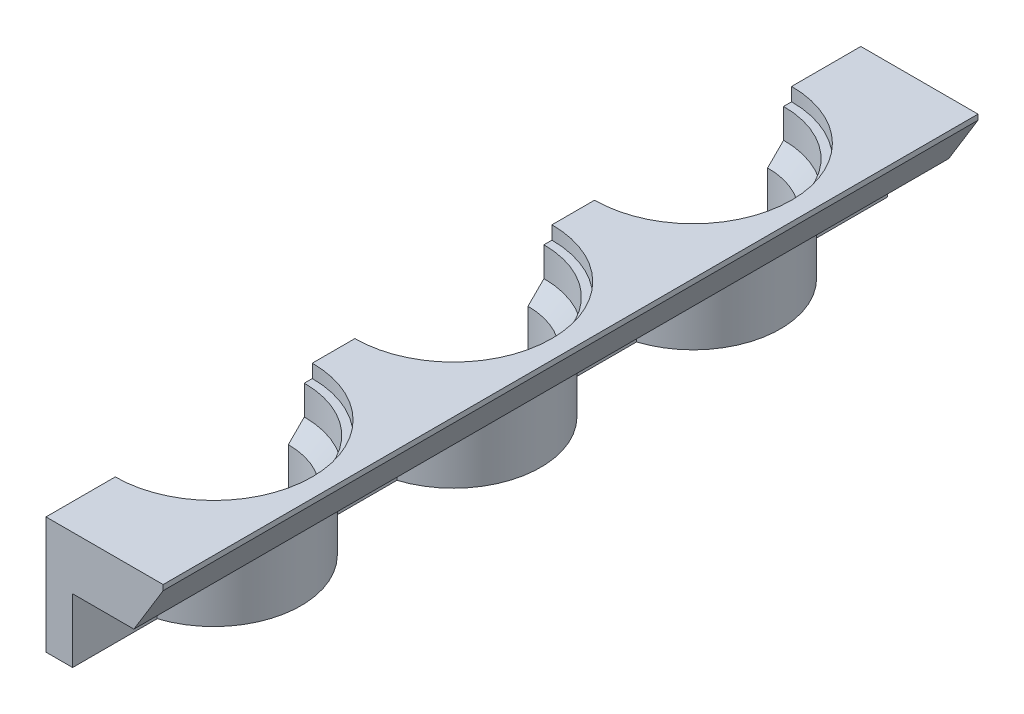
ISO-10303-21;
HEADER;
FILE_DESCRIPTION(('STEP AP214'),'2;1');
FILE_NAME('part.step','',(''),(''),'','','');
FILE_SCHEMA(('AUTOMOTIVE_DESIGN { 1 0 10303 214 1 1 1 1 }'));
ENDSEC;
DATA;
#1=APPLICATION_CONTEXT('core data for automotive mechanical design processes');
#2=APPLICATION_PROTOCOL_DEFINITION('international standard','automotive_design',2000,#1);
#3=PRODUCT_CONTEXT('',#1,'mechanical');
#4=PRODUCT('Part','Part','',(#3));
#5=PRODUCT_RELATED_PRODUCT_CATEGORY('part','',(#4));
#6=PRODUCT_DEFINITION_FORMATION('','',#4);
#7=PRODUCT_DEFINITION_CONTEXT('part definition',#1,'design');
#8=PRODUCT_DEFINITION('design','',#6,#7);
#9=PRODUCT_DEFINITION_SHAPE('','',#8);
#10=(LENGTH_UNIT() NAMED_UNIT(*) SI_UNIT(.MILLI.,.METRE.));
#11=(NAMED_UNIT(*) PLANE_ANGLE_UNIT() SI_UNIT($,.RADIAN.));
#12=(NAMED_UNIT(*) SI_UNIT($,.STERADIAN.) SOLID_ANGLE_UNIT());
#13=UNCERTAINTY_MEASURE_WITH_UNIT(LENGTH_MEASURE(1.E-05),#10,'distance_accuracy_value','');
#14=(GEOMETRIC_REPRESENTATION_CONTEXT(3) GLOBAL_UNCERTAINTY_ASSIGNED_CONTEXT((#13)) GLOBAL_UNIT_ASSIGNED_CONTEXT((#10,
#11,#12)) REPRESENTATION_CONTEXT('',''));
#15=CARTESIAN_POINT('',(0.,0.,0.));
#16=DIRECTION('',(0.,0.,1.));
#17=DIRECTION('',(1.,0.,0.));
#18=AXIS2_PLACEMENT_3D('',#15,#16,#17);
#19=CARTESIAN_POINT('',(0.,-10.,0.));
#20=DIRECTION('',(0.,1.,0.));
#21=DIRECTION('',(0.,0.,1.));
#22=AXIS2_PLACEMENT_3D('',#19,#20,#21);
#23=PLANE('',#22);
#24=DIRECTION('',(-1.,0.,0.));
#25=VECTOR('',#24,1.);
#26=CARTESIAN_POINT('',(0.,-10.,-121.5));
#27=LINE('',#26,#25);
#28=CARTESIAN_POINT('',(16.5,-10.,-121.5));
#29=VERTEX_POINT('',#28);
#30=CARTESIAN_POINT('',(5.00000000000001,-10.,-121.5));
#31=VERTEX_POINT('',#30);
#32=EDGE_CURVE('E312',#29,#31,#27,.T.);
#33=ORIENTED_EDGE('',*,*,#32,.F.);
#34=DIRECTION('',(0.,0.,1.));
#35=VECTOR('',#34,1.);
#36=CARTESIAN_POINT('',(16.5,-10.,31.5));
#37=LINE('',#36,#35);
#38=CARTESIAN_POINT('',(16.5,-10.,31.5));
#39=VERTEX_POINT('',#38);
#40=EDGE_CURVE('E300',#29,#39,#37,.T.);
#41=ORIENTED_EDGE('',*,*,#40,.T.);
#42=DIRECTION('',(1.,0.,0.));
#43=VECTOR('',#42,1.);
#44=CARTESIAN_POINT('',(0.,-10.,31.5));
#45=LINE('',#44,#43);
#46=CARTESIAN_POINT('',(5.00000000000001,-10.,31.5));
#47=VERTEX_POINT('',#46);
#48=EDGE_CURVE('E320',#47,#39,#45,.T.);
#49=ORIENTED_EDGE('',*,*,#48,.F.);
#50=DIRECTION('',(0.,0.,1.));
#51=VECTOR('',#50,1.);
#52=CARTESIAN_POINT('',(5.,-10.,15.6192189305355));
#53=LINE('',#52,#51);
#54=CARTESIAN_POINT('',(5.,-10.,15.6192189305355));
#55=VERTEX_POINT('',#54);
#56=EDGE_CURVE('E366',#55,#47,#53,.T.);
#57=ORIENTED_EDGE('',*,*,#56,.F.);
#58=CARTESIAN_POINT('',(0.,-10.,0.));
#59=DIRECTION('',(0.,-1.,0.));
#60=DIRECTION('',(0.,0.,-1.));
#61=AXIS2_PLACEMENT_3D('',#58,#59,#60);
#62=CIRCLE('',#61,16.4);
#63=CARTESIAN_POINT('',(5.,-10.,-15.6192189305355));
#64=VERTEX_POINT('',#63);
#65=EDGE_CURVE('E370',#64,#55,#62,.T.);
#66=ORIENTED_EDGE('',*,*,#65,.F.);
#67=DIRECTION('',(0.,0.,1.));
#68=VECTOR('',#67,1.);
#69=CARTESIAN_POINT('',(5.,-10.,-29.3807810694645));
#70=LINE('',#69,#68);
#71=CARTESIAN_POINT('',(5.,-10.,-29.3807810694645));
#72=VERTEX_POINT('',#71);
#73=EDGE_CURVE('E373',#72,#64,#70,.T.);
#74=ORIENTED_EDGE('',*,*,#73,.F.);
#75=CARTESIAN_POINT('',(0.,-10.,-45.));
#76=DIRECTION('',(0.,-1.,0.));
#77=DIRECTION('',(0.,0.,-1.));
#78=AXIS2_PLACEMENT_3D('',#75,#76,#77);
#79=CIRCLE('',#78,16.4);
#80=CARTESIAN_POINT('',(5.,-10.,-60.6192189305355));
#81=VERTEX_POINT('',#80);
#82=EDGE_CURVE('E376',#81,#72,#79,.T.);
#83=ORIENTED_EDGE('',*,*,#82,.F.);
#84=DIRECTION('',(0.,0.,1.));
#85=VECTOR('',#84,1.);
#86=CARTESIAN_POINT('',(5.,-10.,-74.3807810694645));
#87=LINE('',#86,#85);
#88=CARTESIAN_POINT('',(5.,-10.,-74.3807810694645));
#89=VERTEX_POINT('',#88);
#90=EDGE_CURVE('E379',#89,#81,#87,.T.);
#91=ORIENTED_EDGE('',*,*,#90,.F.);
#92=CARTESIAN_POINT('',(0.,-10.,-90.));
#93=DIRECTION('',(0.,-1.,0.));
#94=DIRECTION('',(0.,0.,-1.));
#95=AXIS2_PLACEMENT_3D('',#92,#93,#94);
#96=CIRCLE('',#95,16.4);
#97=CARTESIAN_POINT('',(5.,-10.,-105.619218930536));
#98=VERTEX_POINT('',#97);
#99=EDGE_CURVE('E382',#98,#89,#96,.T.);
#100=ORIENTED_EDGE('',*,*,#99,.F.);
#101=DIRECTION('',(0.,0.,1.));
#102=VECTOR('',#101,1.);
#103=CARTESIAN_POINT('',(5.00000000000001,-10.,-121.5));
#104=LINE('',#103,#102);
#105=EDGE_CURVE('E385',#31,#98,#104,.T.);
#106=ORIENTED_EDGE('',*,*,#105,.F.);
#107=EDGE_LOOP('',(#33,#41,#49,#57,#66,#74,#83,#91,#100,#106));
#108=FACE_BOUND('',#107,.T.);
#109=ADVANCED_FACE('F44',(#108),#23,.F.);
#110=CARTESIAN_POINT('',(0.,-10.,-11.4));
#111=DIRECTION('',(-1.,0.,0.));
#112=DIRECTION('',(0.,0.,1.));
#113=AXIS2_PLACEMENT_3D('',#110,#111,#112);
#114=PLANE('',#113);
#115=CARTESIAN_POINT('',(0.,-13.,-22.5));
#116=DIRECTION('',(-1.,0.,0.));
#117=DIRECTION('',(0.,0.,1.));
#118=AXIS2_PLACEMENT_3D('',#115,#116,#117);
#119=CIRCLE('',#118,1.5);
#120=CARTESIAN_POINT('',(0.,-13.,-21.));
#121=VERTEX_POINT('',#120);
#122=EDGE_CURVE('E493',#121,#121,#119,.T.);
#123=ORIENTED_EDGE('',*,*,#122,.F.);
#124=EDGE_LOOP('',(#123));
#125=FACE_BOUND('',#124,.T.);
#126=DIRECTION('',(0.,1.,0.));
#127=VECTOR('',#126,1.);
#128=CARTESIAN_POINT('',(0.,0.,-14.));
#129=LINE('',#128,#127);
#130=CARTESIAN_POINT('',(0.,-11.,-14.));
#131=VERTEX_POINT('',#130);
#132=CARTESIAN_POINT('',(0.,-22.,-14.));
#133=VERTEX_POINT('',#132);
#134=EDGE_CURVE('E60',#131,#133,#129,.F.);
#135=ORIENTED_EDGE('',*,*,#134,.F.);
#136=DIRECTION('',(0.,-0.707106781186549,0.707106781186546));
#137=VECTOR('',#136,1.);
#138=CARTESIAN_POINT('',(0.,-25.,0.));
#139=LINE('',#138,#137);
#140=CARTESIAN_POINT('',(0.,-8.,-17.));
#141=VERTEX_POINT('',#140);
#142=EDGE_CURVE('E264',#141,#131,#139,.T.);
#143=ORIENTED_EDGE('',*,*,#142,.F.);
#144=DIRECTION('',(0.,1.,0.));
#145=VECTOR('',#144,1.);
#146=CARTESIAN_POINT('',(0.,0.,-17.));
#147=LINE('',#146,#145);
#148=CARTESIAN_POINT('',(0.,-2.5,-17.));
#149=VERTEX_POINT('',#148);
#150=EDGE_CURVE('E464',#149,#141,#147,.F.);
#151=ORIENTED_EDGE('',*,*,#150,.F.);
#152=DIRECTION('',(0.,0.,-1.));
#153=VECTOR('',#152,1.);
#154=CARTESIAN_POINT('',(0.,-2.5,-11.4));
#155=LINE('',#154,#153);
#156=CARTESIAN_POINT('',(0.,-2.5,-18.5));
#157=VERTEX_POINT('',#156);
#158=EDGE_CURVE('E473',#149,#157,#155,.T.);
#159=ORIENTED_EDGE('',*,*,#158,.T.);
#160=DIRECTION('',(0.,1.,0.));
#161=VECTOR('',#160,1.);
#162=CARTESIAN_POINT('',(0.,0.,-18.5));
#163=LINE('',#162,#161);
#164=CARTESIAN_POINT('',(0.,0.,-18.5));
#165=VERTEX_POINT('',#164);
#166=EDGE_CURVE('E476',#165,#157,#163,.F.);
#167=ORIENTED_EDGE('',*,*,#166,.F.);
#168=DIRECTION('',(0.,0.,1.));
#169=VECTOR('',#168,1.);
#170=CARTESIAN_POINT('',(0.,0.,-11.4));
#171=LINE('',#170,#169);
#172=CARTESIAN_POINT('',(0.,0.,-26.5));
#173=VERTEX_POINT('',#172);
#174=EDGE_CURVE('E317',#173,#165,#171,.T.);
#175=ORIENTED_EDGE('',*,*,#174,.F.);
#176=DIRECTION('',(0.,1.,0.));
#177=VECTOR('',#176,1.);
#178=CARTESIAN_POINT('',(0.,0.,-26.5));
#179=LINE('',#178,#177);
#180=CARTESIAN_POINT('',(0.,-2.5,-26.5));
#181=VERTEX_POINT('',#180);
#182=EDGE_CURVE('E450',#181,#173,#179,.T.);
#183=ORIENTED_EDGE('',*,*,#182,.F.);
#184=DIRECTION('',(0.,0.,-1.));
#185=VECTOR('',#184,1.);
#186=CARTESIAN_POINT('',(0.,-2.5,-11.4));
#187=LINE('',#186,#185);
#188=CARTESIAN_POINT('',(0.,-2.5,-28.));
#189=VERTEX_POINT('',#188);
#190=EDGE_CURVE('E447',#181,#189,#187,.T.);
#191=ORIENTED_EDGE('',*,*,#190,.T.);
#192=DIRECTION('',(0.,1.,0.));
#193=VECTOR('',#192,1.);
#194=CARTESIAN_POINT('',(0.,0.,-28.));
#195=LINE('',#194,#193);
#196=CARTESIAN_POINT('',(0.,-8.,-28.));
#197=VERTEX_POINT('',#196);
#198=EDGE_CURVE('E436',#197,#189,#195,.T.);
#199=ORIENTED_EDGE('',*,*,#198,.F.);
#200=DIRECTION('',(0.,0.707106781186549,0.707106781186546));
#201=VECTOR('',#200,1.);
#202=CARTESIAN_POINT('',(0.,-25.,-45.));
#203=LINE('',#202,#201);
#204=CARTESIAN_POINT('',(0.,-11.,-31.));
#205=VERTEX_POINT('',#204);
#206=EDGE_CURVE('E445',#205,#197,#203,.T.);
#207=ORIENTED_EDGE('',*,*,#206,.F.);
#208=DIRECTION('',(0.,1.,0.));
#209=VECTOR('',#208,1.);
#210=CARTESIAN_POINT('',(0.,0.,-31.));
#211=LINE('',#210,#209);
#212=CARTESIAN_POINT('',(0.,-22.,-31.));
#213=VERTEX_POINT('',#212);
#214=EDGE_CURVE('E454',#213,#205,#211,.T.);
#215=ORIENTED_EDGE('',*,*,#214,.F.);
#216=DIRECTION('',(0.,0.,-1.));
#217=VECTOR('',#216,1.);
#218=CARTESIAN_POINT('',(0.,-22.,-33.6));
#219=LINE('',#218,#217);
#220=EDGE_CURVE('E392',#133,#213,#219,.T.);
#221=ORIENTED_EDGE('',*,*,#220,.F.);
#222=EDGE_LOOP('',(#135,#143,#151,#159,#167,#175,#183,#191,#199,#207,#215,#221));
#223=FACE_BOUND('',#222,.T.);
#224=ADVANCED_FACE('F584',(#125,#223),#114,.T.);
#225=CARTESIAN_POINT('',(0.,-10.,-56.4));
#226=DIRECTION('',(-1.,0.,0.));
#227=DIRECTION('',(0.,0.,1.));
#228=AXIS2_PLACEMENT_3D('',#225,#226,#227);
#229=PLANE('',#228);
#230=CARTESIAN_POINT('',(0.,-13.,-67.5));
#231=DIRECTION('',(-1.,0.,0.));
#232=DIRECTION('',(0.,0.,1.));
#233=AXIS2_PLACEMENT_3D('',#230,#231,#232);
#234=CIRCLE('',#233,1.5);
#235=CARTESIAN_POINT('',(0.,-13.,-66.));
#236=VERTEX_POINT('',#235);
#237=EDGE_CURVE('E485',#236,#236,#234,.T.);
#238=ORIENTED_EDGE('',*,*,#237,.F.);
#239=EDGE_LOOP('',(#238));
#240=FACE_BOUND('',#239,.T.);
#241=DIRECTION('',(0.,1.,0.));
#242=VECTOR('',#241,1.);
#243=CARTESIAN_POINT('',(0.,0.,-59.));
#244=LINE('',#243,#242);
#245=CARTESIAN_POINT('',(0.,-11.,-59.));
#246=VERTEX_POINT('',#245);
#247=CARTESIAN_POINT('',(0.,-22.,-59.));
#248=VERTEX_POINT('',#247);
#249=EDGE_CURVE('E68',#246,#248,#244,.F.);
#250=ORIENTED_EDGE('',*,*,#249,.F.);
#251=DIRECTION('',(0.,-0.707106781186549,0.707106781186546));
#252=VECTOR('',#251,1.);
#253=CARTESIAN_POINT('',(0.,-25.,-45.));
#254=LINE('',#253,#252);
#255=CARTESIAN_POINT('',(0.,-8.,-62.));
#256=VERTEX_POINT('',#255);
#257=EDGE_CURVE('E279',#256,#246,#254,.T.);
#258=ORIENTED_EDGE('',*,*,#257,.F.);
#259=DIRECTION('',(0.,1.,0.));
#260=VECTOR('',#259,1.);
#261=CARTESIAN_POINT('',(0.,0.,-62.));
#262=LINE('',#261,#260);
#263=CARTESIAN_POINT('',(0.,-2.5,-62.));
#264=VERTEX_POINT('',#263);
#265=EDGE_CURVE('E281',#264,#256,#262,.F.);
#266=ORIENTED_EDGE('',*,*,#265,.F.);
#267=DIRECTION('',(0.,0.,-1.));
#268=VECTOR('',#267,1.);
#269=CARTESIAN_POINT('',(0.,-2.5,-56.4));
#270=LINE('',#269,#268);
#271=CARTESIAN_POINT('',(0.,-2.5,-63.5));
#272=VERTEX_POINT('',#271);
#273=EDGE_CURVE('E283',#264,#272,#270,.T.);
#274=ORIENTED_EDGE('',*,*,#273,.T.);
#275=DIRECTION('',(0.,1.,0.));
#276=VECTOR('',#275,1.);
#277=CARTESIAN_POINT('',(0.,0.,-63.5));
#278=LINE('',#277,#276);
#279=CARTESIAN_POINT('',(0.,0.,-63.5));
#280=VERTEX_POINT('',#279);
#281=EDGE_CURVE('E452',#280,#272,#278,.F.);
#282=ORIENTED_EDGE('',*,*,#281,.F.);
#283=DIRECTION('',(0.,0.,1.));
#284=VECTOR('',#283,1.);
#285=CARTESIAN_POINT('',(0.,0.,-56.4));
#286=LINE('',#285,#284);
#287=CARTESIAN_POINT('',(0.,0.,-71.5));
#288=VERTEX_POINT('',#287);
#289=EDGE_CURVE('E321',#288,#280,#286,.T.);
#290=ORIENTED_EDGE('',*,*,#289,.F.);
#291=DIRECTION('',(0.,1.,0.));
#292=VECTOR('',#291,1.);
#293=CARTESIAN_POINT('',(0.,0.,-71.5));
#294=LINE('',#293,#292);
#295=CARTESIAN_POINT('',(0.,-2.5,-71.5));
#296=VERTEX_POINT('',#295);
#297=EDGE_CURVE('E421',#296,#288,#294,.T.);
#298=ORIENTED_EDGE('',*,*,#297,.F.);
#299=DIRECTION('',(0.,0.,-1.));
#300=VECTOR('',#299,1.);
#301=CARTESIAN_POINT('',(0.,-2.5,-56.4));
#302=LINE('',#301,#300);
#303=CARTESIAN_POINT('',(0.,-2.5,-73.));
#304=VERTEX_POINT('',#303);
#305=EDGE_CURVE('E418',#296,#304,#302,.T.);
#306=ORIENTED_EDGE('',*,*,#305,.T.);
#307=DIRECTION('',(0.,1.,0.));
#308=VECTOR('',#307,1.);
#309=CARTESIAN_POINT('',(0.,0.,-73.));
#310=LINE('',#309,#308);
#311=CARTESIAN_POINT('',(0.,-8.,-73.));
#312=VERTEX_POINT('',#311);
#313=EDGE_CURVE('E388',#312,#304,#310,.T.);
#314=ORIENTED_EDGE('',*,*,#313,.F.);
#315=DIRECTION('',(0.,0.707106781186549,0.707106781186546));
#316=VECTOR('',#315,1.);
#317=CARTESIAN_POINT('',(0.,-25.,-90.));
#318=LINE('',#317,#316);
#319=CARTESIAN_POINT('',(0.,-11.,-76.));
#320=VERTEX_POINT('',#319);
#321=EDGE_CURVE('E416',#320,#312,#318,.T.);
#322=ORIENTED_EDGE('',*,*,#321,.F.);
#323=DIRECTION('',(0.,1.,0.));
#324=VECTOR('',#323,1.);
#325=CARTESIAN_POINT('',(0.,0.,-76.));
#326=LINE('',#325,#324);
#327=CARTESIAN_POINT('',(0.,-22.,-76.));
#328=VERTEX_POINT('',#327);
#329=EDGE_CURVE('E425',#328,#320,#326,.T.);
#330=ORIENTED_EDGE('',*,*,#329,.F.);
#331=DIRECTION('',(0.,0.,-1.));
#332=VECTOR('',#331,1.);
#333=CARTESIAN_POINT('',(0.,-22.,-78.6));
#334=LINE('',#333,#332);
#335=EDGE_CURVE('E390',#248,#328,#334,.T.);
#336=ORIENTED_EDGE('',*,*,#335,.F.);
#337=EDGE_LOOP('',(#250,#258,#266,#274,#282,#290,#298,#306,#314,#322,#330,#336));
#338=FACE_BOUND('',#337,.T.);
#339=ADVANCED_FACE('F589',(#240,#338),#229,.T.);
#340=CARTESIAN_POINT('',(0.,-10.,-101.4));
#341=DIRECTION('',(-1.,0.,0.));
#342=DIRECTION('',(0.,0.,1.));
#343=AXIS2_PLACEMENT_3D('',#340,#341,#342);
#344=PLANE('',#343);
#345=CARTESIAN_POINT('',(0.,-13.,-112.5));
#346=DIRECTION('',(-1.,0.,0.));
#347=DIRECTION('',(0.,0.,1.));
#348=AXIS2_PLACEMENT_3D('',#345,#346,#347);
#349=CIRCLE('',#348,1.5);
#350=CARTESIAN_POINT('',(0.,-13.,-111.));
#351=VERTEX_POINT('',#350);
#352=EDGE_CURVE('E503',#351,#351,#349,.T.);
#353=ORIENTED_EDGE('',*,*,#352,.F.);
#354=EDGE_LOOP('',(#353));
#355=FACE_BOUND('',#354,.T.);
#356=DIRECTION('',(0.,1.,0.));
#357=VECTOR('',#356,1.);
#358=CARTESIAN_POINT('',(0.,0.,-104.));
#359=LINE('',#358,#357);
#360=CARTESIAN_POINT('',(0.,-11.,-104.));
#361=VERTEX_POINT('',#360);
#362=CARTESIAN_POINT('',(0.,-22.,-104.));
#363=VERTEX_POINT('',#362);
#364=EDGE_CURVE('E427',#361,#363,#359,.F.);
#365=ORIENTED_EDGE('',*,*,#364,.F.);
#366=DIRECTION('',(0.,-0.707106781186549,0.707106781186546));
#367=VECTOR('',#366,1.);
#368=CARTESIAN_POINT('',(0.,-25.,-90.));
#369=LINE('',#368,#367);
#370=CARTESIAN_POINT('',(0.,-8.,-107.));
#371=VERTEX_POINT('',#370);
#372=EDGE_CURVE('E288',#371,#361,#369,.T.);
#373=ORIENTED_EDGE('',*,*,#372,.F.);
#374=DIRECTION('',(0.,1.,0.));
#375=VECTOR('',#374,1.);
#376=CARTESIAN_POINT('',(0.,0.,-107.));
#377=LINE('',#376,#375);
#378=CARTESIAN_POINT('',(0.,-2.5,-107.));
#379=VERTEX_POINT('',#378);
#380=EDGE_CURVE('E290',#379,#371,#377,.F.);
#381=ORIENTED_EDGE('',*,*,#380,.F.);
#382=DIRECTION('',(0.,0.,-1.));
#383=VECTOR('',#382,1.);
#384=CARTESIAN_POINT('',(0.,-2.5,-101.4));
#385=LINE('',#384,#383);
#386=CARTESIAN_POINT('',(0.,-2.5,-108.5));
#387=VERTEX_POINT('',#386);
#388=EDGE_CURVE('E292',#379,#387,#385,.T.);
#389=ORIENTED_EDGE('',*,*,#388,.T.);
#390=DIRECTION('',(0.,1.,0.));
#391=VECTOR('',#390,1.);
#392=CARTESIAN_POINT('',(0.,0.,-108.5));
#393=LINE('',#392,#391);
#394=CARTESIAN_POINT('',(0.,0.,-108.5));
#395=VERTEX_POINT('',#394);
#396=EDGE_CURVE('E423',#395,#387,#393,.F.);
#397=ORIENTED_EDGE('',*,*,#396,.F.);
#398=DIRECTION('',(0.,0.,1.));
#399=VECTOR('',#398,1.);
#400=CARTESIAN_POINT('',(0.,0.,-101.4));
#401=LINE('',#400,#399);
#402=CARTESIAN_POINT('',(0.,0.,-121.5));
#403=VERTEX_POINT('',#402);
#404=EDGE_CURVE('E324',#403,#395,#401,.T.);
#405=ORIENTED_EDGE('',*,*,#404,.F.);
#406=DIRECTION('',(0.,1.,0.));
#407=VECTOR('',#406,1.);
#408=CARTESIAN_POINT('',(0.,-10.,-121.5));
#409=LINE('',#408,#407);
#410=CARTESIAN_POINT('',(0.,-22.,-121.5));
#411=VERTEX_POINT('',#410);
#412=EDGE_CURVE('E307',#411,#403,#409,.T.);
#413=ORIENTED_EDGE('',*,*,#412,.F.);
#414=DIRECTION('',(0.,0.,-1.));
#415=VECTOR('',#414,1.);
#416=CARTESIAN_POINT('',(0.,-22.,-121.5));
#417=LINE('',#416,#415);
#418=EDGE_CURVE('E365',#363,#411,#417,.T.);
#419=ORIENTED_EDGE('',*,*,#418,.F.);
#420=EDGE_LOOP('',(#365,#373,#381,#389,#397,#405,#413,#419));
#421=FACE_BOUND('',#420,.T.);
#422=ADVANCED_FACE('F597',(#355,#421),#344,.T.);
#423=CARTESIAN_POINT('',(0.,-10.,-121.5));
#424=DIRECTION('',(0.,0.,-1.));
#425=DIRECTION('',(-1.,0.,0.));
#426=AXIS2_PLACEMENT_3D('',#423,#424,#425);
#427=PLANE('',#426);
#428=DIRECTION('',(0.,1.,0.));
#429=VECTOR('',#428,1.);
#430=CARTESIAN_POINT('',(22.,-10.,-121.5));
#431=LINE('',#430,#429);
#432=CARTESIAN_POINT('',(22.,-0.999999999999937,-121.5));
#433=VERTEX_POINT('',#432);
#434=CARTESIAN_POINT('',(22.,0.,-121.5));
#435=VERTEX_POINT('',#434);
#436=EDGE_CURVE('E314',#433,#435,#431,.T.);
#437=ORIENTED_EDGE('',*,*,#436,.F.);
#438=DIRECTION('',(-0.521450009453974,-0.85328183365196,0.));
#439=VECTOR('',#438,1.);
#440=CARTESIAN_POINT('',(12.0134831460674,-17.3415730337078,-121.5));
#441=LINE('',#440,#439);
#442=EDGE_CURVE('E302',#433,#29,#441,.T.);
#443=ORIENTED_EDGE('',*,*,#442,.T.);
#444=ORIENTED_EDGE('',*,*,#32,.T.);
#445=DIRECTION('',(0.,1.,0.));
#446=VECTOR('',#445,1.);
#447=CARTESIAN_POINT('',(5.00000000000001,-22.,-121.5));
#448=LINE('',#447,#446);
#449=CARTESIAN_POINT('',(5.00000000000001,-22.,-121.5));
#450=VERTEX_POINT('',#449);
#451=EDGE_CURVE('E338',#450,#31,#448,.T.);
#452=ORIENTED_EDGE('',*,*,#451,.F.);
#453=DIRECTION('',(1.,0.,0.));
#454=VECTOR('',#453,1.);
#455=CARTESIAN_POINT('',(0.,-22.,-121.5));
#456=LINE('',#455,#454);
#457=EDGE_CURVE('E369',#411,#450,#456,.T.);
#458=ORIENTED_EDGE('',*,*,#457,.F.);
#459=ORIENTED_EDGE('',*,*,#412,.T.);
#460=DIRECTION('',(-1.,0.,0.));
#461=VECTOR('',#460,1.);
#462=CARTESIAN_POINT('',(0.,0.,-121.5));
#463=LINE('',#462,#461);
#464=EDGE_CURVE('E327',#435,#403,#463,.T.);
#465=ORIENTED_EDGE('',*,*,#464,.F.);
#466=EDGE_LOOP('',(#437,#443,#444,#452,#458,#459,#465));
#467=FACE_BOUND('',#466,.T.);
#468=ADVANCED_FACE('F538',(#467),#427,.T.);
#469=CARTESIAN_POINT('',(22.,-10.,31.5));
#470=DIRECTION('',(1.,0.,0.));
#471=DIRECTION('',(0.,0.,-1.));
#472=AXIS2_PLACEMENT_3D('',#469,#470,#471);
#473=PLANE('',#472);
#474=DIRECTION('',(0.,1.,0.));
#475=VECTOR('',#474,1.);
#476=CARTESIAN_POINT('',(22.,-10.,31.5));
#477=LINE('',#476,#475);
#478=CARTESIAN_POINT('',(22.,-0.999999999999937,31.5));
#479=VERTEX_POINT('',#478);
#480=CARTESIAN_POINT('',(22.,0.,31.5));
#481=VERTEX_POINT('',#480);
#482=EDGE_CURVE('E311',#479,#481,#477,.T.);
#483=ORIENTED_EDGE('',*,*,#482,.F.);
#484=DIRECTION('',(0.,0.,-1.));
#485=VECTOR('',#484,1.);
#486=CARTESIAN_POINT('',(22.,-0.999999999999937,-121.5));
#487=LINE('',#486,#485);
#488=EDGE_CURVE('E304',#479,#433,#487,.T.);
#489=ORIENTED_EDGE('',*,*,#488,.T.);
#490=ORIENTED_EDGE('',*,*,#436,.T.);
#491=DIRECTION('',(0.,0.,-1.));
#492=VECTOR('',#491,1.);
#493=CARTESIAN_POINT('',(22.,0.,31.5));
#494=LINE('',#493,#492);
#495=EDGE_CURVE('E330',#481,#435,#494,.T.);
#496=ORIENTED_EDGE('',*,*,#495,.F.);
#497=EDGE_LOOP('',(#483,#489,#490,#496));
#498=FACE_BOUND('',#497,.T.);
#499=ADVANCED_FACE('F549',(#498),#473,.T.);
#500=CARTESIAN_POINT('',(0.,-10.,31.5));
#501=DIRECTION('',(0.,0.,1.));
#502=DIRECTION('',(1.,0.,0.));
#503=AXIS2_PLACEMENT_3D('',#500,#501,#502);
#504=PLANE('',#503);
#505=ORIENTED_EDGE('',*,*,#48,.T.);
#506=DIRECTION('',(0.521450009453974,0.85328183365196,0.));
#507=VECTOR('',#506,1.);
#508=CARTESIAN_POINT('',(12.0134831460674,-17.3415730337078,31.5));
#509=LINE('',#508,#507);
#510=EDGE_CURVE('E298',#39,#479,#509,.T.);
#511=ORIENTED_EDGE('',*,*,#510,.T.);
#512=ORIENTED_EDGE('',*,*,#482,.T.);
#513=DIRECTION('',(1.,0.,0.));
#514=VECTOR('',#513,1.);
#515=CARTESIAN_POINT('',(0.,0.,31.5));
#516=LINE('',#515,#514);
#517=CARTESIAN_POINT('',(0.,0.,31.5));
#518=VERTEX_POINT('',#517);
#519=EDGE_CURVE('E333',#518,#481,#516,.T.);
#520=ORIENTED_EDGE('',*,*,#519,.F.);
#521=DIRECTION('',(0.,1.,0.));
#522=VECTOR('',#521,1.);
#523=CARTESIAN_POINT('',(0.,-10.,31.5));
#524=LINE('',#523,#522);
#525=CARTESIAN_POINT('',(0.,-22.,31.5));
#526=VERTEX_POINT('',#525);
#527=EDGE_CURVE('E308',#526,#518,#524,.T.);
#528=ORIENTED_EDGE('',*,*,#527,.F.);
#529=DIRECTION('',(-1.,0.,0.));
#530=VECTOR('',#529,1.);
#531=CARTESIAN_POINT('',(0.,-22.,31.5));
#532=LINE('',#531,#530);
#533=CARTESIAN_POINT('',(5.00000000000001,-22.,31.5));
#534=VERTEX_POINT('',#533);
#535=EDGE_CURVE('E396',#534,#526,#532,.T.);
#536=ORIENTED_EDGE('',*,*,#535,.F.);
#537=DIRECTION('',(0.,1.,0.));
#538=VECTOR('',#537,1.);
#539=CARTESIAN_POINT('',(5.00000000000001,-22.,31.5));
#540=LINE('',#539,#538);
#541=EDGE_CURVE('E362',#534,#47,#540,.T.);
#542=ORIENTED_EDGE('',*,*,#541,.T.);
#543=EDGE_LOOP('',(#505,#511,#512,#520,#528,#536,#542));
#544=FACE_BOUND('',#543,.T.);
#545=ADVANCED_FACE('F545',(#544),#504,.T.);
#546=CARTESIAN_POINT('',(0.,-10.,11.4));
#547=DIRECTION('',(-1.,0.,0.));
#548=DIRECTION('',(0.,0.,1.));
#549=AXIS2_PLACEMENT_3D('',#546,#547,#548);
#550=PLANE('',#549);
#551=CARTESIAN_POINT('',(0.,-13.,22.5));
#552=DIRECTION('',(-1.,0.,0.));
#553=DIRECTION('',(0.,0.,1.));
#554=AXIS2_PLACEMENT_3D('',#551,#552,#553);
#555=CIRCLE('',#554,1.5);
#556=CARTESIAN_POINT('',(0.,-13.,24.));
#557=VERTEX_POINT('',#556);
#558=EDGE_CURVE('E496',#557,#557,#555,.T.);
#559=ORIENTED_EDGE('',*,*,#558,.F.);
#560=EDGE_LOOP('',(#559));
#561=FACE_BOUND('',#560,.T.);
#562=DIRECTION('',(0.,1.,0.));
#563=VECTOR('',#562,1.);
#564=CARTESIAN_POINT('',(0.,0.,14.));
#565=LINE('',#564,#563);
#566=CARTESIAN_POINT('',(0.,-22.,14.));
#567=VERTEX_POINT('',#566);
#568=CARTESIAN_POINT('',(0.,-11.,14.));
#569=VERTEX_POINT('',#568);
#570=EDGE_CURVE('E248',#567,#569,#565,.T.);
#571=ORIENTED_EDGE('',*,*,#570,.F.);
#572=DIRECTION('',(0.,0.,-1.));
#573=VECTOR('',#572,1.);
#574=CARTESIAN_POINT('',(0.,-22.,11.4));
#575=LINE('',#574,#573);
#576=EDGE_CURVE('E394',#526,#567,#575,.T.);
#577=ORIENTED_EDGE('',*,*,#576,.F.);
#578=ORIENTED_EDGE('',*,*,#527,.T.);
#579=DIRECTION('',(0.,0.,1.));
#580=VECTOR('',#579,1.);
#581=CARTESIAN_POINT('',(0.,0.,11.4));
#582=LINE('',#581,#580);
#583=CARTESIAN_POINT('',(0.,0.,18.5));
#584=VERTEX_POINT('',#583);
#585=EDGE_CURVE('E336',#584,#518,#582,.T.);
#586=ORIENTED_EDGE('',*,*,#585,.F.);
#587=DIRECTION('',(0.,1.,0.));
#588=VECTOR('',#587,1.);
#589=CARTESIAN_POINT('',(0.,0.,18.5));
#590=LINE('',#589,#588);
#591=CARTESIAN_POINT('',(0.,-2.5,18.5));
#592=VERTEX_POINT('',#591);
#593=EDGE_CURVE('E478',#592,#584,#590,.T.);
#594=ORIENTED_EDGE('',*,*,#593,.F.);
#595=DIRECTION('',(0.,0.,-1.));
#596=VECTOR('',#595,1.);
#597=CARTESIAN_POINT('',(0.,-2.5,11.4));
#598=LINE('',#597,#596);
#599=CARTESIAN_POINT('',(0.,-2.5,17.));
#600=VERTEX_POINT('',#599);
#601=EDGE_CURVE('E272',#592,#600,#598,.T.);
#602=ORIENTED_EDGE('',*,*,#601,.T.);
#603=DIRECTION('',(0.,1.,0.));
#604=VECTOR('',#603,1.);
#605=CARTESIAN_POINT('',(0.,0.,17.));
#606=LINE('',#605,#604);
#607=CARTESIAN_POINT('',(0.,-8.,17.));
#608=VERTEX_POINT('',#607);
#609=EDGE_CURVE('E53',#608,#600,#606,.T.);
#610=ORIENTED_EDGE('',*,*,#609,.F.);
#611=DIRECTION('',(0.,0.707106781186549,0.707106781186546));
#612=VECTOR('',#611,1.);
#613=CARTESIAN_POINT('',(0.,-25.,0.));
#614=LINE('',#613,#612);
#615=EDGE_CURVE('E11',#569,#608,#614,.T.);
#616=ORIENTED_EDGE('',*,*,#615,.F.);
#617=EDGE_LOOP('',(#571,#577,#578,#586,#594,#602,#610,#616));
#618=FACE_BOUND('',#617,.T.);
#619=ADVANCED_FACE('F269',(#561,#618),#550,.T.);
#620=CARTESIAN_POINT('',(0.,0.,0.));
#621=DIRECTION('',(0.,1.,0.));
#622=DIRECTION('',(0.,0.,1.));
#623=AXIS2_PLACEMENT_3D('',#620,#621,#622);
#624=PLANE('',#623);
#625=CARTESIAN_POINT('',(0.,0.,0.));
#626=DIRECTION('',(0.,1.,0.));
#627=DIRECTION('',(0.,0.,1.));
#628=AXIS2_PLACEMENT_3D('',#625,#626,#627);
#629=CIRCLE('',#628,18.5);
#630=EDGE_CURVE('E266',#584,#165,#629,.T.);
#631=ORIENTED_EDGE('',*,*,#630,.F.);
#632=ORIENTED_EDGE('',*,*,#585,.T.);
#633=ORIENTED_EDGE('',*,*,#519,.T.);
#634=ORIENTED_EDGE('',*,*,#495,.T.);
#635=ORIENTED_EDGE('',*,*,#464,.T.);
#636=ORIENTED_EDGE('',*,*,#404,.T.);
#637=CARTESIAN_POINT('',(0.,0.,-90.));
#638=DIRECTION('',(0.,1.,0.));
#639=DIRECTION('',(0.,0.,1.));
#640=AXIS2_PLACEMENT_3D('',#637,#638,#639);
#641=CIRCLE('',#640,18.5);
#642=EDGE_CURVE('E430',#288,#395,#641,.T.);
#643=ORIENTED_EDGE('',*,*,#642,.F.);
#644=ORIENTED_EDGE('',*,*,#289,.T.);
#645=CARTESIAN_POINT('',(0.,0.,-45.));
#646=DIRECTION('',(0.,1.,0.));
#647=DIRECTION('',(0.,0.,1.));
#648=AXIS2_PLACEMENT_3D('',#645,#646,#647);
#649=CIRCLE('',#648,18.5);
#650=EDGE_CURVE('E458',#173,#280,#649,.T.);
#651=ORIENTED_EDGE('',*,*,#650,.F.);
#652=ORIENTED_EDGE('',*,*,#174,.T.);
#653=EDGE_LOOP('',(#631,#632,#633,#634,#635,#636,#643,#644,#651,#652));
#654=FACE_BOUND('',#653,.T.);
#655=ADVANCED_FACE('F518',(#654),#624,.T.);
#656=CARTESIAN_POINT('',(5.00000000000001,-22.,-121.5));
#657=DIRECTION('',(-1.,0.,0.));
#658=DIRECTION('',(0.,0.,1.));
#659=AXIS2_PLACEMENT_3D('',#656,#657,#658);
#660=PLANE('',#659);
#661=CARTESIAN_POINT('',(5.,-13.,-112.5));
#662=DIRECTION('',(1.,0.,0.));
#663=DIRECTION('',(0.,0.,-1.));
#664=AXIS2_PLACEMENT_3D('',#661,#662,#663);
#665=CIRCLE('',#664,1.5);
#666=CARTESIAN_POINT('',(5.,-13.,-114.));
#667=VERTEX_POINT('',#666);
#668=EDGE_CURVE('E508',#667,#667,#665,.T.);
#669=ORIENTED_EDGE('',*,*,#668,.F.);
#670=EDGE_LOOP('',(#669));
#671=FACE_BOUND('',#670,.T.);
#672=ORIENTED_EDGE('',*,*,#105,.T.);
#673=DIRECTION('',(0.,1.,0.));
#674=VECTOR('',#673,1.);
#675=CARTESIAN_POINT('',(5.,-22.,-105.619218930536));
#676=LINE('',#675,#674);
#677=CARTESIAN_POINT('',(5.,-22.,-105.619218930536));
#678=VERTEX_POINT('',#677);
#679=EDGE_CURVE('E344',#678,#98,#676,.T.);
#680=ORIENTED_EDGE('',*,*,#679,.F.);
#681=DIRECTION('',(0.,0.,1.));
#682=VECTOR('',#681,1.);
#683=CARTESIAN_POINT('',(5.00000000000001,-22.,-121.5));
#684=LINE('',#683,#682);
#685=EDGE_CURVE('E411',#450,#678,#684,.T.);
#686=ORIENTED_EDGE('',*,*,#685,.F.);
#687=ORIENTED_EDGE('',*,*,#451,.T.);
#688=EDGE_LOOP('',(#672,#680,#686,#687));
#689=FACE_BOUND('',#688,.T.);
#690=ADVANCED_FACE('F514',(#671,#689),#660,.F.);
#691=CARTESIAN_POINT('',(0.,-22.,-90.));
#692=DIRECTION('',(0.,1.,0.));
#693=DIRECTION('',(0.,0.,1.));
#694=AXIS2_PLACEMENT_3D('',#691,#692,#693);
#695=CYLINDRICAL_SURFACE('',#694,16.4);
#696=ORIENTED_EDGE('',*,*,#99,.T.);
#697=DIRECTION('',(0.,1.,0.));
#698=VECTOR('',#697,1.);
#699=CARTESIAN_POINT('',(5.,-22.,-74.3807810694645));
#700=LINE('',#699,#698);
#701=CARTESIAN_POINT('',(5.,-22.,-74.3807810694645));
#702=VERTEX_POINT('',#701);
#703=EDGE_CURVE('E347',#702,#89,#700,.T.);
#704=ORIENTED_EDGE('',*,*,#703,.F.);
#705=CARTESIAN_POINT('',(0.,-22.,-90.));
#706=DIRECTION('',(0.,-1.,0.));
#707=DIRECTION('',(0.,0.,-1.));
#708=AXIS2_PLACEMENT_3D('',#705,#706,#707);
#709=CIRCLE('',#708,16.4);
#710=EDGE_CURVE('E409',#678,#702,#709,.T.);
#711=ORIENTED_EDGE('',*,*,#710,.F.);
#712=ORIENTED_EDGE('',*,*,#679,.T.);
#713=EDGE_LOOP('',(#696,#704,#711,#712));
#714=FACE_BOUND('',#713,.T.);
#715=ADVANCED_FACE('F517',(#714),#695,.T.);
#716=CARTESIAN_POINT('',(5.,-22.,-74.3807810694645));
#717=DIRECTION('',(-1.,0.,0.));
#718=DIRECTION('',(0.,0.,1.));
#719=AXIS2_PLACEMENT_3D('',#716,#717,#718);
#720=PLANE('',#719);
#721=CARTESIAN_POINT('',(5.,-13.,-67.5));
#722=DIRECTION('',(1.,0.,0.));
#723=DIRECTION('',(0.,0.,-1.));
#724=AXIS2_PLACEMENT_3D('',#721,#722,#723);
#725=CIRCLE('',#724,1.5);
#726=CARTESIAN_POINT('',(5.,-13.,-69.));
#727=VERTEX_POINT('',#726);
#728=EDGE_CURVE('E490',#727,#727,#725,.T.);
#729=ORIENTED_EDGE('',*,*,#728,.F.);
#730=EDGE_LOOP('',(#729));
#731=FACE_BOUND('',#730,.T.);
#732=ORIENTED_EDGE('',*,*,#90,.T.);
#733=DIRECTION('',(0.,1.,0.));
#734=VECTOR('',#733,1.);
#735=CARTESIAN_POINT('',(5.,-22.,-60.6192189305355));
#736=LINE('',#735,#734);
#737=CARTESIAN_POINT('',(5.,-22.,-60.6192189305355));
#738=VERTEX_POINT('',#737);
#739=EDGE_CURVE('E350',#738,#81,#736,.T.);
#740=ORIENTED_EDGE('',*,*,#739,.F.);
#741=DIRECTION('',(0.,0.,1.));
#742=VECTOR('',#741,1.);
#743=CARTESIAN_POINT('',(5.,-22.,-74.3807810694645));
#744=LINE('',#743,#742);
#745=EDGE_CURVE('E407',#702,#738,#744,.T.);
#746=ORIENTED_EDGE('',*,*,#745,.F.);
#747=ORIENTED_EDGE('',*,*,#703,.T.);
#748=EDGE_LOOP('',(#732,#740,#746,#747));
#749=FACE_BOUND('',#748,.T.);
#750=ADVANCED_FACE('F572',(#731,#749),#720,.F.);
#751=CARTESIAN_POINT('',(0.,-22.,-45.));
#752=DIRECTION('',(0.,1.,0.));
#753=DIRECTION('',(0.,0.,1.));
#754=AXIS2_PLACEMENT_3D('',#751,#752,#753);
#755=CYLINDRICAL_SURFACE('',#754,16.4);
#756=ORIENTED_EDGE('',*,*,#82,.T.);
#757=DIRECTION('',(0.,1.,0.));
#758=VECTOR('',#757,1.);
#759=CARTESIAN_POINT('',(5.,-22.,-29.3807810694645));
#760=LINE('',#759,#758);
#761=CARTESIAN_POINT('',(5.,-22.,-29.3807810694645));
#762=VERTEX_POINT('',#761);
#763=EDGE_CURVE('E353',#762,#72,#760,.T.);
#764=ORIENTED_EDGE('',*,*,#763,.F.);
#765=CARTESIAN_POINT('',(0.,-22.,-45.));
#766=DIRECTION('',(0.,-1.,0.));
#767=DIRECTION('',(0.,0.,-1.));
#768=AXIS2_PLACEMENT_3D('',#765,#766,#767);
#769=CIRCLE('',#768,16.4);
#770=EDGE_CURVE('E405',#738,#762,#769,.T.);
#771=ORIENTED_EDGE('',*,*,#770,.F.);
#772=ORIENTED_EDGE('',*,*,#739,.T.);
#773=EDGE_LOOP('',(#756,#764,#771,#772));
#774=FACE_BOUND('',#773,.T.);
#775=ADVANCED_FACE('F569',(#774),#755,.T.);
#776=CARTESIAN_POINT('',(5.,-22.,-29.3807810694645));
#777=DIRECTION('',(-1.,0.,0.));
#778=DIRECTION('',(0.,0.,1.));
#779=AXIS2_PLACEMENT_3D('',#776,#777,#778);
#780=PLANE('',#779);
#781=CARTESIAN_POINT('',(5.,-13.,-22.5));
#782=DIRECTION('',(1.,0.,0.));
#783=DIRECTION('',(0.,0.,-1.));
#784=AXIS2_PLACEMENT_3D('',#781,#782,#783);
#785=CIRCLE('',#784,1.5);
#786=CARTESIAN_POINT('',(5.,-13.,-24.));
#787=VERTEX_POINT('',#786);
#788=EDGE_CURVE('E499',#787,#787,#785,.T.);
#789=ORIENTED_EDGE('',*,*,#788,.F.);
#790=EDGE_LOOP('',(#789));
#791=FACE_BOUND('',#790,.T.);
#792=ORIENTED_EDGE('',*,*,#73,.T.);
#793=DIRECTION('',(0.,1.,0.));
#794=VECTOR('',#793,1.);
#795=CARTESIAN_POINT('',(5.,-22.,-15.6192189305355));
#796=LINE('',#795,#794);
#797=CARTESIAN_POINT('',(5.,-22.,-15.6192189305355));
#798=VERTEX_POINT('',#797);
#799=EDGE_CURVE('E356',#798,#64,#796,.T.);
#800=ORIENTED_EDGE('',*,*,#799,.F.);
#801=DIRECTION('',(0.,0.,1.));
#802=VECTOR('',#801,1.);
#803=CARTESIAN_POINT('',(5.,-22.,-29.3807810694645));
#804=LINE('',#803,#802);
#805=EDGE_CURVE('E403',#762,#798,#804,.T.);
#806=ORIENTED_EDGE('',*,*,#805,.F.);
#807=ORIENTED_EDGE('',*,*,#763,.T.);
#808=EDGE_LOOP('',(#792,#800,#806,#807));
#809=FACE_BOUND('',#808,.T.);
#810=ADVANCED_FACE('F566',(#791,#809),#780,.F.);
#811=CARTESIAN_POINT('',(0.,-22.,0.));
#812=DIRECTION('',(0.,1.,0.));
#813=DIRECTION('',(0.,0.,1.));
#814=AXIS2_PLACEMENT_3D('',#811,#812,#813);
#815=CYLINDRICAL_SURFACE('',#814,16.4);
#816=ORIENTED_EDGE('',*,*,#65,.T.);
#817=DIRECTION('',(0.,1.,0.));
#818=VECTOR('',#817,1.);
#819=CARTESIAN_POINT('',(5.,-22.,15.6192189305355));
#820=LINE('',#819,#818);
#821=CARTESIAN_POINT('',(5.,-22.,15.6192189305355));
#822=VERTEX_POINT('',#821);
#823=EDGE_CURVE('E359',#822,#55,#820,.T.);
#824=ORIENTED_EDGE('',*,*,#823,.F.);
#825=CARTESIAN_POINT('',(0.,-22.,0.));
#826=DIRECTION('',(0.,-1.,0.));
#827=DIRECTION('',(0.,0.,-1.));
#828=AXIS2_PLACEMENT_3D('',#825,#826,#827);
#829=CIRCLE('',#828,16.4);
#830=EDGE_CURVE('E401',#798,#822,#829,.T.);
#831=ORIENTED_EDGE('',*,*,#830,.F.);
#832=ORIENTED_EDGE('',*,*,#799,.T.);
#833=EDGE_LOOP('',(#816,#824,#831,#832));
#834=FACE_BOUND('',#833,.T.);
#835=ADVANCED_FACE('F562',(#834),#815,.T.);
#836=CARTESIAN_POINT('',(5.,-22.,15.6192189305355));
#837=DIRECTION('',(-1.,0.,0.));
#838=DIRECTION('',(0.,0.,1.));
#839=AXIS2_PLACEMENT_3D('',#836,#837,#838);
#840=PLANE('',#839);
#841=CARTESIAN_POINT('',(5.,-13.,22.5));
#842=DIRECTION('',(1.,0.,0.));
#843=DIRECTION('',(0.,0.,-1.));
#844=AXIS2_PLACEMENT_3D('',#841,#842,#843);
#845=CIRCLE('',#844,1.5);
#846=CARTESIAN_POINT('',(5.,-13.,21.));
#847=VERTEX_POINT('',#846);
#848=EDGE_CURVE('E500',#847,#847,#845,.T.);
#849=ORIENTED_EDGE('',*,*,#848,.F.);
#850=EDGE_LOOP('',(#849));
#851=FACE_BOUND('',#850,.T.);
#852=ORIENTED_EDGE('',*,*,#56,.T.);
#853=ORIENTED_EDGE('',*,*,#541,.F.);
#854=DIRECTION('',(0.,0.,1.));
#855=VECTOR('',#854,1.);
#856=CARTESIAN_POINT('',(5.,-22.,15.6192189305355));
#857=LINE('',#856,#855);
#858=EDGE_CURVE('E399',#822,#534,#857,.T.);
#859=ORIENTED_EDGE('',*,*,#858,.F.);
#860=ORIENTED_EDGE('',*,*,#823,.T.);
#861=EDGE_LOOP('',(#852,#853,#859,#860));
#862=FACE_BOUND('',#861,.T.);
#863=ADVANCED_FACE('F560',(#851,#862),#840,.F.);
#864=CARTESIAN_POINT('',(0.,-22.,-90.));
#865=DIRECTION('',(0.,-1.,0.));
#866=DIRECTION('',(0.,0.,-1.));
#867=AXIS2_PLACEMENT_3D('',#864,#865,#866);
#868=PLANE('',#867);
#869=CARTESIAN_POINT('',(0.,-22.,0.));
#870=DIRECTION('',(0.,-1.,0.));
#871=DIRECTION('',(0.,0.,-1.));
#872=AXIS2_PLACEMENT_3D('',#869,#870,#871);
#873=CIRCLE('',#872,14.);
#874=EDGE_CURVE('E252',#133,#567,#873,.T.);
#875=ORIENTED_EDGE('',*,*,#874,.F.);
#876=ORIENTED_EDGE('',*,*,#220,.T.);
#877=CARTESIAN_POINT('',(0.,-22.,-45.));
#878=DIRECTION('',(0.,-1.,0.));
#879=DIRECTION('',(0.,0.,-1.));
#880=AXIS2_PLACEMENT_3D('',#877,#878,#879);
#881=CIRCLE('',#880,14.);
#882=EDGE_CURVE('E286',#248,#213,#881,.T.);
#883=ORIENTED_EDGE('',*,*,#882,.F.);
#884=ORIENTED_EDGE('',*,*,#335,.T.);
#885=CARTESIAN_POINT('',(0.,-22.,-90.));
#886=DIRECTION('',(0.,-1.,0.));
#887=DIRECTION('',(0.,0.,-1.));
#888=AXIS2_PLACEMENT_3D('',#885,#886,#887);
#889=CIRCLE('',#888,14.);
#890=EDGE_CURVE('E295',#363,#328,#889,.T.);
#891=ORIENTED_EDGE('',*,*,#890,.F.);
#892=ORIENTED_EDGE('',*,*,#418,.T.);
#893=ORIENTED_EDGE('',*,*,#457,.T.);
#894=ORIENTED_EDGE('',*,*,#685,.T.);
#895=ORIENTED_EDGE('',*,*,#710,.T.);
#896=ORIENTED_EDGE('',*,*,#745,.T.);
#897=ORIENTED_EDGE('',*,*,#770,.T.);
#898=ORIENTED_EDGE('',*,*,#805,.T.);
#899=ORIENTED_EDGE('',*,*,#830,.T.);
#900=ORIENTED_EDGE('',*,*,#858,.T.);
#901=ORIENTED_EDGE('',*,*,#535,.T.);
#902=ORIENTED_EDGE('',*,*,#576,.T.);
#903=EDGE_LOOP('',(#875,#876,#883,#884,#891,#892,#893,#894,#895,#896,#897,#898,#899,#900,#901,#902));
#904=FACE_BOUND('',#903,.T.);
#905=ADVANCED_FACE('F530',(#904),#868,.T.);
#906=CARTESIAN_POINT('',(22.,-0.999999999999937,31.5));
#907=DIRECTION('',(0.85328183365196,-0.521450009453973,0.));
#908=DIRECTION('',(0.,0.,1.));
#909=AXIS2_PLACEMENT_3D('',#906,#907,#908);
#910=PLANE('',#909);
#911=ORIENTED_EDGE('',*,*,#510,.F.);
#912=ORIENTED_EDGE('',*,*,#40,.F.);
#913=ORIENTED_EDGE('',*,*,#442,.F.);
#914=ORIENTED_EDGE('',*,*,#488,.F.);
#915=EDGE_LOOP('',(#911,#912,#913,#914));
#916=FACE_BOUND('',#915,.T.);
#917=ADVANCED_FACE('F47',(#916),#910,.T.);
#918=CARTESIAN_POINT('',(0.,0.,-90.));
#919=DIRECTION('',(0.,1.,0.));
#920=DIRECTION('',(0.,0.,1.));
#921=AXIS2_PLACEMENT_3D('',#918,#919,#920);
#922=CYLINDRICAL_SURFACE('',#921,14.);
#923=ORIENTED_EDGE('',*,*,#329,.T.);
#924=CARTESIAN_POINT('',(0.,-11.,-90.));
#925=DIRECTION('',(0.,1.,0.));
#926=DIRECTION('',(0.,0.,1.));
#927=AXIS2_PLACEMENT_3D('',#924,#925,#926);
#928=CIRCLE('',#927,14.);
#929=EDGE_CURVE('E432',#320,#361,#928,.T.);
#930=ORIENTED_EDGE('',*,*,#929,.T.);
#931=ORIENTED_EDGE('',*,*,#364,.T.);
#932=ORIENTED_EDGE('',*,*,#890,.T.);
#933=EDGE_LOOP('',(#923,#930,#931,#932));
#934=FACE_BOUND('',#933,.T.);
#935=ADVANCED_FACE('F692',(#934),#922,.F.);
#936=CARTESIAN_POINT('',(0.,0.,-90.));
#937=DIRECTION('',(0.,1.,0.));
#938=DIRECTION('',(0.,0.,1.));
#939=AXIS2_PLACEMENT_3D('',#936,#937,#938);
#940=CYLINDRICAL_SURFACE('',#939,17.);
#941=ORIENTED_EDGE('',*,*,#313,.T.);
#942=CARTESIAN_POINT('',(0.,-2.5,-90.));
#943=DIRECTION('',(0.,1.,0.));
#944=DIRECTION('',(0.,0.,1.));
#945=AXIS2_PLACEMENT_3D('',#942,#943,#944);
#946=CIRCLE('',#945,17.);
#947=EDGE_CURVE('E429',#304,#379,#946,.T.);
#948=ORIENTED_EDGE('',*,*,#947,.T.);
#949=ORIENTED_EDGE('',*,*,#380,.T.);
#950=CARTESIAN_POINT('',(0.,-8.,-90.));
#951=DIRECTION('',(0.,1.,0.));
#952=DIRECTION('',(0.,0.,1.));
#953=AXIS2_PLACEMENT_3D('',#950,#951,#952);
#954=CIRCLE('',#953,17.);
#955=EDGE_CURVE('E439',#312,#371,#954,.T.);
#956=ORIENTED_EDGE('',*,*,#955,.F.);
#957=EDGE_LOOP('',(#941,#948,#949,#956));
#958=FACE_BOUND('',#957,.T.);
#959=ADVANCED_FACE('F688',(#958),#940,.F.);
#960=CARTESIAN_POINT('',(0.,-8.,-90.));
#961=DIRECTION('',(0.,1.,0.));
#962=DIRECTION('',(0.,0.,1.));
#963=AXIS2_PLACEMENT_3D('',#960,#961,#962);
#964=CONICAL_SURFACE('',#963,17.,0.785398163397447);
#965=ORIENTED_EDGE('',*,*,#321,.T.);
#966=ORIENTED_EDGE('',*,*,#955,.T.);
#967=ORIENTED_EDGE('',*,*,#372,.T.);
#968=ORIENTED_EDGE('',*,*,#929,.F.);
#969=EDGE_LOOP('',(#965,#966,#967,#968));
#970=FACE_BOUND('',#969,.T.);
#971=ADVANCED_FACE('F684',(#970),#964,.F.);
#972=CARTESIAN_POINT('',(0.,0.,-90.));
#973=DIRECTION('',(0.,1.,0.));
#974=DIRECTION('',(0.,0.,1.));
#975=AXIS2_PLACEMENT_3D('',#972,#973,#974);
#976=CYLINDRICAL_SURFACE('',#975,18.5);
#977=ORIENTED_EDGE('',*,*,#297,.T.);
#978=ORIENTED_EDGE('',*,*,#642,.T.);
#979=ORIENTED_EDGE('',*,*,#396,.T.);
#980=CARTESIAN_POINT('',(0.,-2.5,-90.));
#981=DIRECTION('',(0.,1.,0.));
#982=DIRECTION('',(0.,0.,1.));
#983=AXIS2_PLACEMENT_3D('',#980,#981,#982);
#984=CIRCLE('',#983,18.5);
#985=EDGE_CURVE('E433',#296,#387,#984,.T.);
#986=ORIENTED_EDGE('',*,*,#985,.F.);
#987=EDGE_LOOP('',(#977,#978,#979,#986));
#988=FACE_BOUND('',#987,.T.);
#989=ADVANCED_FACE('F687',(#988),#976,.F.);
#990=CARTESIAN_POINT('',(0.,-2.5,-90.));
#991=DIRECTION('',(0.,1.,0.));
#992=DIRECTION('',(0.,0.,1.));
#993=AXIS2_PLACEMENT_3D('',#990,#991,#992);
#994=PLANE('',#993);
#995=ORIENTED_EDGE('',*,*,#985,.T.);
#996=ORIENTED_EDGE('',*,*,#388,.F.);
#997=ORIENTED_EDGE('',*,*,#947,.F.);
#998=ORIENTED_EDGE('',*,*,#305,.F.);
#999=EDGE_LOOP('',(#995,#996,#997,#998));
#1000=FACE_BOUND('',#999,.T.);
#1001=ADVANCED_FACE('F677',(#1000),#994,.T.);
#1002=CARTESIAN_POINT('',(0.,0.,-45.));
#1003=DIRECTION('',(0.,1.,0.));
#1004=DIRECTION('',(0.,0.,1.));
#1005=AXIS2_PLACEMENT_3D('',#1002,#1003,#1004);
#1006=CYLINDRICAL_SURFACE('',#1005,14.);
#1007=ORIENTED_EDGE('',*,*,#214,.T.);
#1008=CARTESIAN_POINT('',(0.,-11.,-45.));
#1009=DIRECTION('',(0.,1.,0.));
#1010=DIRECTION('',(0.,0.,1.));
#1011=AXIS2_PLACEMENT_3D('',#1008,#1009,#1010);
#1012=CIRCLE('',#1011,14.);
#1013=EDGE_CURVE('E460',#205,#246,#1012,.T.);
#1014=ORIENTED_EDGE('',*,*,#1013,.T.);
#1015=ORIENTED_EDGE('',*,*,#249,.T.);
#1016=ORIENTED_EDGE('',*,*,#882,.T.);
#1017=EDGE_LOOP('',(#1007,#1014,#1015,#1016));
#1018=FACE_BOUND('',#1017,.T.);
#1019=ADVANCED_FACE('F673',(#1018),#1006,.F.);
#1020=CARTESIAN_POINT('',(0.,0.,-45.));
#1021=DIRECTION('',(0.,1.,0.));
#1022=DIRECTION('',(0.,0.,1.));
#1023=AXIS2_PLACEMENT_3D('',#1020,#1021,#1022);
#1024=CYLINDRICAL_SURFACE('',#1023,17.);
#1025=ORIENTED_EDGE('',*,*,#198,.T.);
#1026=CARTESIAN_POINT('',(0.,-2.5,-45.));
#1027=DIRECTION('',(0.,1.,0.));
#1028=DIRECTION('',(0.,0.,1.));
#1029=AXIS2_PLACEMENT_3D('',#1026,#1027,#1028);
#1030=CIRCLE('',#1029,17.);
#1031=EDGE_CURVE('E457',#189,#264,#1030,.T.);
#1032=ORIENTED_EDGE('',*,*,#1031,.T.);
#1033=ORIENTED_EDGE('',*,*,#265,.T.);
#1034=CARTESIAN_POINT('',(0.,-8.,-45.));
#1035=DIRECTION('',(0.,1.,0.));
#1036=DIRECTION('',(0.,0.,1.));
#1037=AXIS2_PLACEMENT_3D('',#1034,#1035,#1036);
#1038=CIRCLE('',#1037,17.);
#1039=EDGE_CURVE('E467',#197,#256,#1038,.T.);
#1040=ORIENTED_EDGE('',*,*,#1039,.F.);
#1041=EDGE_LOOP('',(#1025,#1032,#1033,#1040));
#1042=FACE_BOUND('',#1041,.T.);
#1043=ADVANCED_FACE('F669',(#1042),#1024,.F.);
#1044=CARTESIAN_POINT('',(0.,-8.,-45.));
#1045=DIRECTION('',(0.,1.,0.));
#1046=DIRECTION('',(0.,0.,1.));
#1047=AXIS2_PLACEMENT_3D('',#1044,#1045,#1046);
#1048=CONICAL_SURFACE('',#1047,17.,0.785398163397447);
#1049=ORIENTED_EDGE('',*,*,#206,.T.);
#1050=ORIENTED_EDGE('',*,*,#1039,.T.);
#1051=ORIENTED_EDGE('',*,*,#257,.T.);
#1052=ORIENTED_EDGE('',*,*,#1013,.F.);
#1053=EDGE_LOOP('',(#1049,#1050,#1051,#1052));
#1054=FACE_BOUND('',#1053,.T.);
#1055=ADVANCED_FACE('F665',(#1054),#1048,.F.);
#1056=CARTESIAN_POINT('',(0.,0.,-45.));
#1057=DIRECTION('',(0.,1.,0.));
#1058=DIRECTION('',(0.,0.,1.));
#1059=AXIS2_PLACEMENT_3D('',#1056,#1057,#1058);
#1060=CYLINDRICAL_SURFACE('',#1059,18.5);
#1061=ORIENTED_EDGE('',*,*,#182,.T.);
#1062=ORIENTED_EDGE('',*,*,#650,.T.);
#1063=ORIENTED_EDGE('',*,*,#281,.T.);
#1064=CARTESIAN_POINT('',(0.,-2.5,-45.));
#1065=DIRECTION('',(0.,1.,0.));
#1066=DIRECTION('',(0.,0.,1.));
#1067=AXIS2_PLACEMENT_3D('',#1064,#1065,#1066);
#1068=CIRCLE('',#1067,18.5);
#1069=EDGE_CURVE('E461',#181,#272,#1068,.T.);
#1070=ORIENTED_EDGE('',*,*,#1069,.F.);
#1071=EDGE_LOOP('',(#1061,#1062,#1063,#1070));
#1072=FACE_BOUND('',#1071,.T.);
#1073=ADVANCED_FACE('F668',(#1072),#1060,.F.);
#1074=CARTESIAN_POINT('',(0.,-2.5,-45.));
#1075=DIRECTION('',(0.,1.,0.));
#1076=DIRECTION('',(0.,0.,1.));
#1077=AXIS2_PLACEMENT_3D('',#1074,#1075,#1076);
#1078=PLANE('',#1077);
#1079=ORIENTED_EDGE('',*,*,#1069,.T.);
#1080=ORIENTED_EDGE('',*,*,#273,.F.);
#1081=ORIENTED_EDGE('',*,*,#1031,.F.);
#1082=ORIENTED_EDGE('',*,*,#190,.F.);
#1083=EDGE_LOOP('',(#1079,#1080,#1081,#1082));
#1084=FACE_BOUND('',#1083,.T.);
#1085=ADVANCED_FACE('F658',(#1084),#1078,.T.);
#1086=CARTESIAN_POINT('',(0.,0.,0.));
#1087=DIRECTION('',(0.,1.,0.));
#1088=DIRECTION('',(0.,0.,1.));
#1089=AXIS2_PLACEMENT_3D('',#1086,#1087,#1088);
#1090=CYLINDRICAL_SURFACE('',#1089,14.);
#1091=ORIENTED_EDGE('',*,*,#134,.T.);
#1092=ORIENTED_EDGE('',*,*,#874,.T.);
#1093=ORIENTED_EDGE('',*,*,#570,.T.);
#1094=CARTESIAN_POINT('',(0.,-11.,0.));
#1095=DIRECTION('',(0.,1.,0.));
#1096=DIRECTION('',(0.,0.,1.));
#1097=AXIS2_PLACEMENT_3D('',#1094,#1095,#1096);
#1098=CIRCLE('',#1097,14.);
#1099=EDGE_CURVE('E251',#569,#131,#1098,.T.);
#1100=ORIENTED_EDGE('',*,*,#1099,.T.);
#1101=EDGE_LOOP('',(#1091,#1092,#1093,#1100));
#1102=FACE_BOUND('',#1101,.T.);
#1103=ADVANCED_FACE('F250',(#1102),#1090,.F.);
#1104=CARTESIAN_POINT('',(0.,0.,0.));
#1105=DIRECTION('',(0.,1.,0.));
#1106=DIRECTION('',(0.,0.,1.));
#1107=AXIS2_PLACEMENT_3D('',#1104,#1105,#1106);
#1108=CYLINDRICAL_SURFACE('',#1107,17.);
#1109=ORIENTED_EDGE('',*,*,#150,.T.);
#1110=CARTESIAN_POINT('',(0.,-8.,0.));
#1111=DIRECTION('',(0.,1.,0.));
#1112=DIRECTION('',(0.,0.,1.));
#1113=AXIS2_PLACEMENT_3D('',#1110,#1111,#1112);
#1114=CIRCLE('',#1113,17.);
#1115=EDGE_CURVE('E265',#608,#141,#1114,.T.);
#1116=ORIENTED_EDGE('',*,*,#1115,.F.);
#1117=ORIENTED_EDGE('',*,*,#609,.T.);
#1118=CARTESIAN_POINT('',(0.,-2.5,0.));
#1119=DIRECTION('',(0.,1.,0.));
#1120=DIRECTION('',(0.,0.,1.));
#1121=AXIS2_PLACEMENT_3D('',#1118,#1119,#1120);
#1122=CIRCLE('',#1121,17.);
#1123=EDGE_CURVE('E257',#600,#149,#1122,.T.);
#1124=ORIENTED_EDGE('',*,*,#1123,.T.);
#1125=EDGE_LOOP('',(#1109,#1116,#1117,#1124));
#1126=FACE_BOUND('',#1125,.T.);
#1127=ADVANCED_FACE('F653',(#1126),#1108,.F.);
#1128=CARTESIAN_POINT('',(0.,-8.,0.));
#1129=DIRECTION('',(0.,1.,0.));
#1130=DIRECTION('',(0.,0.,1.));
#1131=AXIS2_PLACEMENT_3D('',#1128,#1129,#1130);
#1132=CONICAL_SURFACE('',#1131,17.,0.785398163397447);
#1133=ORIENTED_EDGE('',*,*,#142,.T.);
#1134=ORIENTED_EDGE('',*,*,#1099,.F.);
#1135=ORIENTED_EDGE('',*,*,#615,.T.);
#1136=ORIENTED_EDGE('',*,*,#1115,.T.);
#1137=EDGE_LOOP('',(#1133,#1134,#1135,#1136));
#1138=FACE_BOUND('',#1137,.T.);
#1139=ADVANCED_FACE('F260',(#1138),#1132,.F.);
#1140=CARTESIAN_POINT('',(0.,0.,0.));
#1141=DIRECTION('',(0.,1.,0.));
#1142=DIRECTION('',(0.,0.,1.));
#1143=AXIS2_PLACEMENT_3D('',#1140,#1141,#1142);
#1144=CYLINDRICAL_SURFACE('',#1143,18.5);
#1145=ORIENTED_EDGE('',*,*,#166,.T.);
#1146=CARTESIAN_POINT('',(0.,-2.5,0.));
#1147=DIRECTION('',(0.,1.,0.));
#1148=DIRECTION('',(0.,0.,1.));
#1149=AXIS2_PLACEMENT_3D('',#1146,#1147,#1148);
#1150=CIRCLE('',#1149,18.5);
#1151=EDGE_CURVE('E482',#592,#157,#1150,.T.);
#1152=ORIENTED_EDGE('',*,*,#1151,.F.);
#1153=ORIENTED_EDGE('',*,*,#593,.T.);
#1154=ORIENTED_EDGE('',*,*,#630,.T.);
#1155=EDGE_LOOP('',(#1145,#1152,#1153,#1154));
#1156=FACE_BOUND('',#1155,.T.);
#1157=ADVANCED_FACE('F652',(#1156),#1144,.F.);
#1158=CARTESIAN_POINT('',(0.,-2.5,0.));
#1159=DIRECTION('',(0.,1.,0.));
#1160=DIRECTION('',(0.,0.,1.));
#1161=AXIS2_PLACEMENT_3D('',#1158,#1159,#1160);
#1162=PLANE('',#1161);
#1163=ORIENTED_EDGE('',*,*,#1123,.F.);
#1164=ORIENTED_EDGE('',*,*,#601,.F.);
#1165=ORIENTED_EDGE('',*,*,#1151,.T.);
#1166=ORIENTED_EDGE('',*,*,#158,.F.);
#1167=EDGE_LOOP('',(#1163,#1164,#1165,#1166));
#1168=FACE_BOUND('',#1167,.T.);
#1169=ADVANCED_FACE('F648',(#1168),#1162,.T.);
#1170=CARTESIAN_POINT('',(-5.,-13.,-67.5));
#1171=DIRECTION('',(1.,0.,0.));
#1172=DIRECTION('',(0.,0.,-1.));
#1173=AXIS2_PLACEMENT_3D('',#1170,#1171,#1172);
#1174=CYLINDRICAL_SURFACE('',#1173,1.5);
#1175=ORIENTED_EDGE('',*,*,#237,.T.);
#1176=EDGE_LOOP('',(#1175));
#1177=FACE_BOUND('',#1176,.T.);
#1178=ORIENTED_EDGE('',*,*,#728,.T.);
#1179=EDGE_LOOP('',(#1178));
#1180=FACE_BOUND('',#1179,.T.);
#1181=ADVANCED_FACE('F617',(#1177,#1180),#1174,.F.);
#1182=CARTESIAN_POINT('',(-5.,-13.,22.5));
#1183=DIRECTION('',(1.,0.,0.));
#1184=DIRECTION('',(0.,0.,-1.));
#1185=AXIS2_PLACEMENT_3D('',#1182,#1183,#1184);
#1186=CYLINDRICAL_SURFACE('',#1185,1.5);
#1187=ORIENTED_EDGE('',*,*,#558,.T.);
#1188=EDGE_LOOP('',(#1187));
#1189=FACE_BOUND('',#1188,.T.);
#1190=ORIENTED_EDGE('',*,*,#848,.T.);
#1191=EDGE_LOOP('',(#1190));
#1192=FACE_BOUND('',#1191,.T.);
#1193=ADVANCED_FACE('F613',(#1189,#1192),#1186,.F.);
#1194=CARTESIAN_POINT('',(-5.,-13.,-22.5));
#1195=DIRECTION('',(1.,0.,0.));
#1196=DIRECTION('',(0.,0.,-1.));
#1197=AXIS2_PLACEMENT_3D('',#1194,#1195,#1196);
#1198=CYLINDRICAL_SURFACE('',#1197,1.5);
#1199=ORIENTED_EDGE('',*,*,#122,.T.);
#1200=EDGE_LOOP('',(#1199));
#1201=FACE_BOUND('',#1200,.T.);
#1202=ORIENTED_EDGE('',*,*,#788,.T.);
#1203=EDGE_LOOP('',(#1202));
#1204=FACE_BOUND('',#1203,.T.);
#1205=ADVANCED_FACE('F616',(#1201,#1204),#1198,.F.);
#1206=CARTESIAN_POINT('',(-5.,-13.,-112.5));
#1207=DIRECTION('',(1.,0.,0.));
#1208=DIRECTION('',(0.,0.,-1.));
#1209=AXIS2_PLACEMENT_3D('',#1206,#1207,#1208);
#1210=CYLINDRICAL_SURFACE('',#1209,1.5);
#1211=ORIENTED_EDGE('',*,*,#352,.T.);
#1212=EDGE_LOOP('',(#1211));
#1213=FACE_BOUND('',#1212,.T.);
#1214=ORIENTED_EDGE('',*,*,#668,.T.);
#1215=EDGE_LOOP('',(#1214));
#1216=FACE_BOUND('',#1215,.T.);
#1217=ADVANCED_FACE('F512',(#1213,#1216),#1210,.F.);
#1218=CLOSED_SHELL('',(#109,#224,#339,#422,#468,#499,#545,#619,#655,#690,#715,#750,#775,#810,
#835,#863,#905,#917,#935,#959,#971,#989,#1001,#1019,#1043,#1055,#1073,#1085,#1103,#1127,#1139,
#1157,#1169,#1181,#1193,#1205,#1217));
#1219=MANIFOLD_SOLID_BREP('B2',#1218);
#1220=ADVANCED_BREP_SHAPE_REPRESENTATION('',(#18,#1219),#14);
#1221=SHAPE_DEFINITION_REPRESENTATION(#9,#1220);
ENDSEC;
END-ISO-10303-21;
